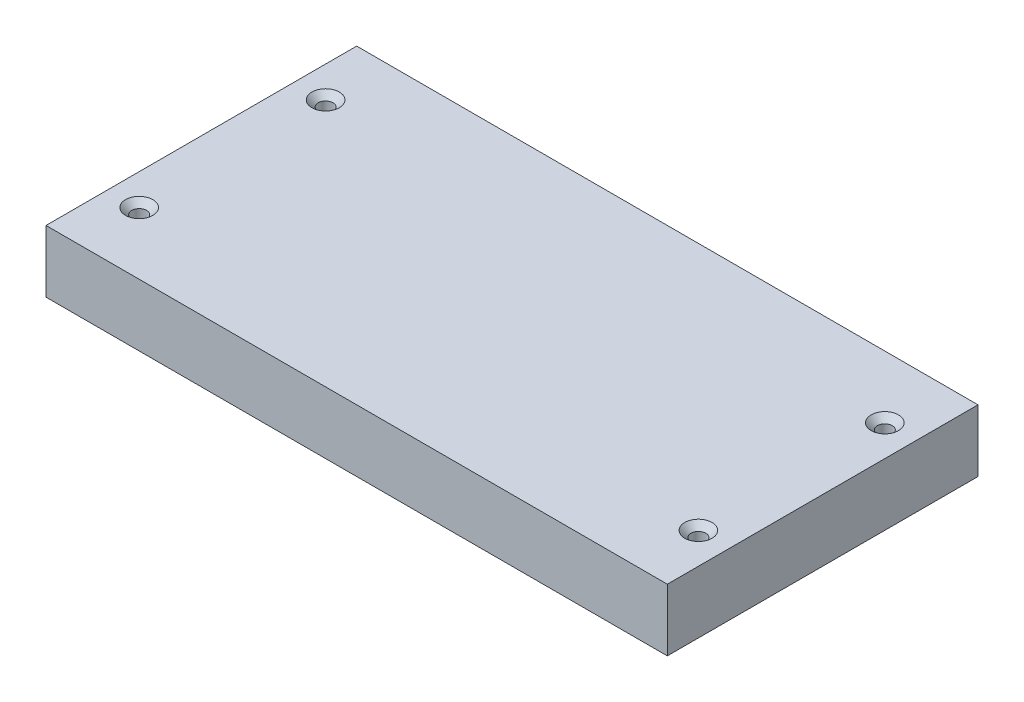
ISO-10303-21;
HEADER;
FILE_DESCRIPTION(('STEP AP214'),'2;1');
FILE_NAME('part.step','',(''),(''),'','','');
FILE_SCHEMA(('AUTOMOTIVE_DESIGN { 1 0 10303 214 1 1 1 1 }'));
ENDSEC;
DATA;
#1=APPLICATION_CONTEXT('core data for automotive mechanical design processes');
#2=APPLICATION_PROTOCOL_DEFINITION('international standard','automotive_design',2000,#1);
#3=PRODUCT_CONTEXT('',#1,'mechanical');
#4=PRODUCT('Part','Part','',(#3));
#5=PRODUCT_RELATED_PRODUCT_CATEGORY('part','',(#4));
#6=PRODUCT_DEFINITION_FORMATION('','',#4);
#7=PRODUCT_DEFINITION_CONTEXT('part definition',#1,'design');
#8=PRODUCT_DEFINITION('design','',#6,#7);
#9=PRODUCT_DEFINITION_SHAPE('','',#8);
#10=(LENGTH_UNIT() NAMED_UNIT(*) SI_UNIT(.MILLI.,.METRE.));
#11=(NAMED_UNIT(*) PLANE_ANGLE_UNIT() SI_UNIT($,.RADIAN.));
#12=(NAMED_UNIT(*) SI_UNIT($,.STERADIAN.) SOLID_ANGLE_UNIT());
#13=UNCERTAINTY_MEASURE_WITH_UNIT(LENGTH_MEASURE(1.E-05),#10,'distance_accuracy_value','');
#14=(GEOMETRIC_REPRESENTATION_CONTEXT(3) GLOBAL_UNCERTAINTY_ASSIGNED_CONTEXT((#13)) GLOBAL_UNIT_ASSIGNED_CONTEXT((#10,
#11,#12)) REPRESENTATION_CONTEXT('',''));
#15=CARTESIAN_POINT('',(0.,0.,0.));
#16=DIRECTION('',(0.,0.,1.));
#17=DIRECTION('',(1.,0.,0.));
#18=AXIS2_PLACEMENT_3D('',#15,#16,#17);
#19=CARTESIAN_POINT('',(-50.,10.,-25.));
#20=DIRECTION('',(1.,0.,0.));
#21=DIRECTION('',(0.,0.,-1.));
#22=AXIS2_PLACEMENT_3D('',#19,#20,#21);
#23=PLANE('',#22);
#24=DIRECTION('',(0.,0.,1.));
#25=VECTOR('',#24,1.);
#26=CARTESIAN_POINT('',(-50.,0.,-25.));
#27=LINE('',#26,#25);
#28=CARTESIAN_POINT('',(-50.,0.,-25.));
#29=VERTEX_POINT('',#28);
#30=CARTESIAN_POINT('',(-50.,0.,25.));
#31=VERTEX_POINT('',#30);
#32=EDGE_CURVE('E96',#29,#31,#27,.T.);
#33=ORIENTED_EDGE('',*,*,#32,.T.);
#34=DIRECTION('',(0.,-1.,0.));
#35=VECTOR('',#34,1.);
#36=CARTESIAN_POINT('',(-50.,10.,25.));
#37=LINE('',#36,#35);
#38=CARTESIAN_POINT('',(-50.,10.,25.));
#39=VERTEX_POINT('',#38);
#40=EDGE_CURVE('E11',#39,#31,#37,.T.);
#41=ORIENTED_EDGE('',*,*,#40,.F.);
#42=DIRECTION('',(0.,0.,1.));
#43=VECTOR('',#42,1.);
#44=CARTESIAN_POINT('',(-50.,10.,-25.));
#45=LINE('',#44,#43);
#46=CARTESIAN_POINT('',(-50.,10.,-25.));
#47=VERTEX_POINT('',#46);
#48=EDGE_CURVE('E84',#47,#39,#45,.T.);
#49=ORIENTED_EDGE('',*,*,#48,.F.);
#50=DIRECTION('',(0.,-1.,0.));
#51=VECTOR('',#50,1.);
#52=CARTESIAN_POINT('',(-50.,10.,-25.));
#53=LINE('',#52,#51);
#54=EDGE_CURVE('E92',#47,#29,#53,.T.);
#55=ORIENTED_EDGE('',*,*,#54,.T.);
#56=EDGE_LOOP('',(#33,#41,#49,#55));
#57=FACE_BOUND('',#56,.T.);
#58=ADVANCED_FACE('F33',(#57),#23,.F.);
#59=CARTESIAN_POINT('',(-50.,10.,25.));
#60=DIRECTION('',(0.,0.,-1.));
#61=DIRECTION('',(-1.,0.,0.));
#62=AXIS2_PLACEMENT_3D('',#59,#60,#61);
#63=PLANE('',#62);
#64=DIRECTION('',(1.,0.,0.));
#65=VECTOR('',#64,1.);
#66=CARTESIAN_POINT('',(-50.,0.,25.));
#67=LINE('',#66,#65);
#68=CARTESIAN_POINT('',(50.,0.,25.));
#69=VERTEX_POINT('',#68);
#70=EDGE_CURVE('E88',#31,#69,#67,.T.);
#71=ORIENTED_EDGE('',*,*,#70,.T.);
#72=DIRECTION('',(0.,-1.,0.));
#73=VECTOR('',#72,1.);
#74=CARTESIAN_POINT('',(50.,10.,25.));
#75=LINE('',#74,#73);
#76=CARTESIAN_POINT('',(50.,10.,25.));
#77=VERTEX_POINT('',#76);
#78=EDGE_CURVE('E41',#77,#69,#75,.T.);
#79=ORIENTED_EDGE('',*,*,#78,.F.);
#80=DIRECTION('',(1.,0.,0.));
#81=VECTOR('',#80,1.);
#82=CARTESIAN_POINT('',(-50.,10.,25.));
#83=LINE('',#82,#81);
#84=EDGE_CURVE('E79',#39,#77,#83,.T.);
#85=ORIENTED_EDGE('',*,*,#84,.F.);
#86=ORIENTED_EDGE('',*,*,#40,.T.);
#87=EDGE_LOOP('',(#71,#79,#85,#86));
#88=FACE_BOUND('',#87,.T.);
#89=ADVANCED_FACE('F87',(#88),#63,.F.);
#90=CARTESIAN_POINT('',(50.,10.,-25.));
#91=DIRECTION('',(-1.,0.,0.));
#92=DIRECTION('',(0.,0.,1.));
#93=AXIS2_PLACEMENT_3D('',#90,#91,#92);
#94=PLANE('',#93);
#95=DIRECTION('',(0.,0.,-1.));
#96=VECTOR('',#95,1.);
#97=CARTESIAN_POINT('',(50.,0.,-25.));
#98=LINE('',#97,#96);
#99=CARTESIAN_POINT('',(50.,0.,-25.));
#100=VERTEX_POINT('',#99);
#101=EDGE_CURVE('E66',#69,#100,#98,.T.);
#102=ORIENTED_EDGE('',*,*,#101,.T.);
#103=DIRECTION('',(0.,-1.,0.));
#104=VECTOR('',#103,1.);
#105=CARTESIAN_POINT('',(50.,10.,-25.));
#106=LINE('',#105,#104);
#107=CARTESIAN_POINT('',(50.,10.,-25.));
#108=VERTEX_POINT('',#107);
#109=EDGE_CURVE('E89',#108,#100,#106,.T.);
#110=ORIENTED_EDGE('',*,*,#109,.F.);
#111=DIRECTION('',(0.,0.,-1.));
#112=VECTOR('',#111,1.);
#113=CARTESIAN_POINT('',(50.,10.,-25.));
#114=LINE('',#113,#112);
#115=EDGE_CURVE('E82',#77,#108,#114,.T.);
#116=ORIENTED_EDGE('',*,*,#115,.F.);
#117=ORIENTED_EDGE('',*,*,#78,.T.);
#118=EDGE_LOOP('',(#102,#110,#116,#117));
#119=FACE_BOUND('',#118,.T.);
#120=ADVANCED_FACE('F90',(#119),#94,.F.);
#121=CARTESIAN_POINT('',(-50.,10.,-25.));
#122=DIRECTION('',(0.,0.,1.));
#123=DIRECTION('',(1.,0.,0.));
#124=AXIS2_PLACEMENT_3D('',#121,#122,#123);
#125=PLANE('',#124);
#126=DIRECTION('',(-1.,0.,0.));
#127=VECTOR('',#126,1.);
#128=CARTESIAN_POINT('',(-50.,0.,-25.));
#129=LINE('',#128,#127);
#130=EDGE_CURVE('E72',#100,#29,#129,.T.);
#131=ORIENTED_EDGE('',*,*,#130,.T.);
#132=ORIENTED_EDGE('',*,*,#54,.F.);
#133=DIRECTION('',(-1.,0.,0.));
#134=VECTOR('',#133,1.);
#135=CARTESIAN_POINT('',(-50.,10.,-25.));
#136=LINE('',#135,#134);
#137=EDGE_CURVE('E49',#108,#47,#136,.T.);
#138=ORIENTED_EDGE('',*,*,#137,.F.);
#139=ORIENTED_EDGE('',*,*,#109,.T.);
#140=EDGE_LOOP('',(#131,#132,#138,#139));
#141=FACE_BOUND('',#140,.T.);
#142=ADVANCED_FACE('F104',(#141),#125,.F.);
#143=CARTESIAN_POINT('',(0.,10.,0.));
#144=DIRECTION('',(0.,1.,0.));
#145=DIRECTION('',(0.,0.,1.));
#146=AXIS2_PLACEMENT_3D('',#143,#144,#145);
#147=PLANE('',#146);
#148=CARTESIAN_POINT('',(-45.,10.,-15.));
#149=DIRECTION('',(0.,1.,0.));
#150=DIRECTION('',(0.,0.,1.));
#151=AXIS2_PLACEMENT_3D('',#148,#149,#150);
#152=CIRCLE('',#151,2.2);
#153=CARTESIAN_POINT('',(-45.,10.,-12.8));
#154=VERTEX_POINT('',#153);
#155=EDGE_CURVE('E142',#154,#154,#152,.T.);
#156=ORIENTED_EDGE('',*,*,#155,.F.);
#157=EDGE_LOOP('',(#156));
#158=FACE_BOUND('',#157,.T.);
#159=CARTESIAN_POINT('',(45.,10.,-15.));
#160=DIRECTION('',(0.,1.,0.));
#161=DIRECTION('',(0.,0.,1.));
#162=AXIS2_PLACEMENT_3D('',#159,#160,#161);
#163=CIRCLE('',#162,2.2);
#164=CARTESIAN_POINT('',(45.,10.,-12.8));
#165=VERTEX_POINT('',#164);
#166=EDGE_CURVE('E133',#165,#165,#163,.T.);
#167=ORIENTED_EDGE('',*,*,#166,.F.);
#168=EDGE_LOOP('',(#167));
#169=FACE_BOUND('',#168,.T.);
#170=CARTESIAN_POINT('',(45.,10.,15.));
#171=DIRECTION('',(0.,1.,0.));
#172=DIRECTION('',(0.,0.,1.));
#173=AXIS2_PLACEMENT_3D('',#170,#171,#172);
#174=CIRCLE('',#173,2.2);
#175=CARTESIAN_POINT('',(45.,10.,17.2));
#176=VERTEX_POINT('',#175);
#177=EDGE_CURVE('E124',#176,#176,#174,.T.);
#178=ORIENTED_EDGE('',*,*,#177,.F.);
#179=EDGE_LOOP('',(#178));
#180=FACE_BOUND('',#179,.T.);
#181=CARTESIAN_POINT('',(-45.,10.,15.));
#182=DIRECTION('',(0.,1.,0.));
#183=DIRECTION('',(0.,0.,1.));
#184=AXIS2_PLACEMENT_3D('',#181,#182,#183);
#185=CIRCLE('',#184,2.2);
#186=CARTESIAN_POINT('',(-45.,10.,17.2));
#187=VERTEX_POINT('',#186);
#188=EDGE_CURVE('E115',#187,#187,#185,.T.);
#189=ORIENTED_EDGE('',*,*,#188,.F.);
#190=EDGE_LOOP('',(#189));
#191=FACE_BOUND('',#190,.T.);
#192=ORIENTED_EDGE('',*,*,#48,.T.);
#193=ORIENTED_EDGE('',*,*,#84,.T.);
#194=ORIENTED_EDGE('',*,*,#115,.T.);
#195=ORIENTED_EDGE('',*,*,#137,.T.);
#196=EDGE_LOOP('',(#192,#193,#194,#195));
#197=FACE_BOUND('',#196,.T.);
#198=ADVANCED_FACE('F80',(#158,#169,#180,#191,#197),#147,.T.);
#199=CARTESIAN_POINT('',(0.,0.,0.));
#200=DIRECTION('',(0.,1.,0.));
#201=DIRECTION('',(0.,0.,1.));
#202=AXIS2_PLACEMENT_3D('',#199,#200,#201);
#203=PLANE('',#202);
#204=CARTESIAN_POINT('',(-45.,0.,-15.));
#205=DIRECTION('',(0.,1.,0.));
#206=DIRECTION('',(0.,0.,1.));
#207=AXIS2_PLACEMENT_3D('',#204,#205,#206);
#208=CIRCLE('',#207,1.2);
#209=CARTESIAN_POINT('',(-45.,0.,-13.8));
#210=VERTEX_POINT('',#209);
#211=EDGE_CURVE('E136',#210,#210,#208,.T.);
#212=ORIENTED_EDGE('',*,*,#211,.T.);
#213=EDGE_LOOP('',(#212));
#214=FACE_BOUND('',#213,.T.);
#215=CARTESIAN_POINT('',(45.,0.,-15.));
#216=DIRECTION('',(0.,1.,0.));
#217=DIRECTION('',(0.,0.,1.));
#218=AXIS2_PLACEMENT_3D('',#215,#216,#217);
#219=CIRCLE('',#218,1.2);
#220=CARTESIAN_POINT('',(45.,0.,-13.8));
#221=VERTEX_POINT('',#220);
#222=EDGE_CURVE('E127',#221,#221,#219,.T.);
#223=ORIENTED_EDGE('',*,*,#222,.T.);
#224=EDGE_LOOP('',(#223));
#225=FACE_BOUND('',#224,.T.);
#226=CARTESIAN_POINT('',(45.,0.,15.));
#227=DIRECTION('',(0.,1.,0.));
#228=DIRECTION('',(0.,0.,1.));
#229=AXIS2_PLACEMENT_3D('',#226,#227,#228);
#230=CIRCLE('',#229,1.2);
#231=CARTESIAN_POINT('',(45.,0.,16.2));
#232=VERTEX_POINT('',#231);
#233=EDGE_CURVE('E118',#232,#232,#230,.T.);
#234=ORIENTED_EDGE('',*,*,#233,.T.);
#235=EDGE_LOOP('',(#234));
#236=FACE_BOUND('',#235,.T.);
#237=CARTESIAN_POINT('',(-45.,0.,15.));
#238=DIRECTION('',(0.,1.,0.));
#239=DIRECTION('',(0.,0.,1.));
#240=AXIS2_PLACEMENT_3D('',#237,#238,#239);
#241=CIRCLE('',#240,1.2);
#242=CARTESIAN_POINT('',(-45.,0.,16.2));
#243=VERTEX_POINT('',#242);
#244=EDGE_CURVE('E99',#243,#243,#241,.T.);
#245=ORIENTED_EDGE('',*,*,#244,.T.);
#246=EDGE_LOOP('',(#245));
#247=FACE_BOUND('',#246,.T.);
#248=ORIENTED_EDGE('',*,*,#32,.F.);
#249=ORIENTED_EDGE('',*,*,#130,.F.);
#250=ORIENTED_EDGE('',*,*,#101,.F.);
#251=ORIENTED_EDGE('',*,*,#70,.F.);
#252=EDGE_LOOP('',(#248,#249,#250,#251));
#253=FACE_BOUND('',#252,.T.);
#254=ADVANCED_FACE('F107',(#214,#225,#236,#247,#253),#203,.F.);
#255=CARTESIAN_POINT('',(-45.,10.,15.));
#256=DIRECTION('',(0.,1.,0.));
#257=DIRECTION('',(0.,0.,1.));
#258=AXIS2_PLACEMENT_3D('',#255,#256,#257);
#259=CYLINDRICAL_SURFACE('',#258,1.2);
#260=ORIENTED_EDGE('',*,*,#244,.F.);
#261=EDGE_LOOP('',(#260));
#262=FACE_BOUND('',#261,.T.);
#263=CARTESIAN_POINT('',(-45.,9.,15.));
#264=DIRECTION('',(0.,1.,0.));
#265=DIRECTION('',(0.,0.,1.));
#266=AXIS2_PLACEMENT_3D('',#263,#264,#265);
#267=CIRCLE('',#266,1.2);
#268=CARTESIAN_POINT('',(-45.,9.,16.2));
#269=VERTEX_POINT('',#268);
#270=EDGE_CURVE('E112',#269,#269,#267,.T.);
#271=ORIENTED_EDGE('',*,*,#270,.T.);
#272=EDGE_LOOP('',(#271));
#273=FACE_BOUND('',#272,.T.);
#274=ADVANCED_FACE('F160',(#262,#273),#259,.F.);
#275=CARTESIAN_POINT('',(-45.,10.,15.));
#276=DIRECTION('',(0.,1.,0.));
#277=DIRECTION('',(0.,0.,1.));
#278=AXIS2_PLACEMENT_3D('',#275,#276,#277);
#279=CONICAL_SURFACE('',#278,2.2,0.785398163397447);
#280=ORIENTED_EDGE('',*,*,#270,.F.);
#281=EDGE_LOOP('',(#280));
#282=FACE_BOUND('',#281,.T.);
#283=ORIENTED_EDGE('',*,*,#188,.T.);
#284=EDGE_LOOP('',(#283));
#285=FACE_BOUND('',#284,.T.);
#286=ADVANCED_FACE('F157',(#282,#285),#279,.F.);
#287=CARTESIAN_POINT('',(45.,10.,15.));
#288=DIRECTION('',(0.,1.,0.));
#289=DIRECTION('',(0.,0.,1.));
#290=AXIS2_PLACEMENT_3D('',#287,#288,#289);
#291=CYLINDRICAL_SURFACE('',#290,1.2);
#292=ORIENTED_EDGE('',*,*,#233,.F.);
#293=EDGE_LOOP('',(#292));
#294=FACE_BOUND('',#293,.T.);
#295=CARTESIAN_POINT('',(45.,9.,15.));
#296=DIRECTION('',(0.,1.,0.));
#297=DIRECTION('',(0.,0.,1.));
#298=AXIS2_PLACEMENT_3D('',#295,#296,#297);
#299=CIRCLE('',#298,1.2);
#300=CARTESIAN_POINT('',(45.,9.,16.2));
#301=VERTEX_POINT('',#300);
#302=EDGE_CURVE('E121',#301,#301,#299,.T.);
#303=ORIENTED_EDGE('',*,*,#302,.T.);
#304=EDGE_LOOP('',(#303));
#305=FACE_BOUND('',#304,.T.);
#306=ADVANCED_FACE('F159',(#294,#305),#291,.F.);
#307=CARTESIAN_POINT('',(45.,10.,15.));
#308=DIRECTION('',(0.,1.,0.));
#309=DIRECTION('',(0.,0.,1.));
#310=AXIS2_PLACEMENT_3D('',#307,#308,#309);
#311=CONICAL_SURFACE('',#310,2.2,0.785398163397447);
#312=ORIENTED_EDGE('',*,*,#302,.F.);
#313=EDGE_LOOP('',(#312));
#314=FACE_BOUND('',#313,.T.);
#315=ORIENTED_EDGE('',*,*,#177,.T.);
#316=EDGE_LOOP('',(#315));
#317=FACE_BOUND('',#316,.T.);
#318=ADVANCED_FACE('F167',(#314,#317),#311,.F.);
#319=CARTESIAN_POINT('',(45.,10.,-15.));
#320=DIRECTION('',(0.,1.,0.));
#321=DIRECTION('',(0.,0.,1.));
#322=AXIS2_PLACEMENT_3D('',#319,#320,#321);
#323=CYLINDRICAL_SURFACE('',#322,1.2);
#324=ORIENTED_EDGE('',*,*,#222,.F.);
#325=EDGE_LOOP('',(#324));
#326=FACE_BOUND('',#325,.T.);
#327=CARTESIAN_POINT('',(45.,9.,-15.));
#328=DIRECTION('',(0.,1.,0.));
#329=DIRECTION('',(0.,0.,1.));
#330=AXIS2_PLACEMENT_3D('',#327,#328,#329);
#331=CIRCLE('',#330,1.2);
#332=CARTESIAN_POINT('',(45.,9.,-13.8));
#333=VERTEX_POINT('',#332);
#334=EDGE_CURVE('E130',#333,#333,#331,.T.);
#335=ORIENTED_EDGE('',*,*,#334,.T.);
#336=EDGE_LOOP('',(#335));
#337=FACE_BOUND('',#336,.T.);
#338=ADVANCED_FACE('F201',(#326,#337),#323,.F.);
#339=CARTESIAN_POINT('',(45.,10.,-15.));
#340=DIRECTION('',(0.,1.,0.));
#341=DIRECTION('',(0.,0.,1.));
#342=AXIS2_PLACEMENT_3D('',#339,#340,#341);
#343=CONICAL_SURFACE('',#342,2.2,0.785398163397447);
#344=ORIENTED_EDGE('',*,*,#334,.F.);
#345=EDGE_LOOP('',(#344));
#346=FACE_BOUND('',#345,.T.);
#347=ORIENTED_EDGE('',*,*,#166,.T.);
#348=EDGE_LOOP('',(#347));
#349=FACE_BOUND('',#348,.T.);
#350=ADVANCED_FACE('F206',(#346,#349),#343,.F.);
#351=CARTESIAN_POINT('',(-45.,10.,-15.));
#352=DIRECTION('',(0.,1.,0.));
#353=DIRECTION('',(0.,0.,1.));
#354=AXIS2_PLACEMENT_3D('',#351,#352,#353);
#355=CYLINDRICAL_SURFACE('',#354,1.2);
#356=ORIENTED_EDGE('',*,*,#211,.F.);
#357=EDGE_LOOP('',(#356));
#358=FACE_BOUND('',#357,.T.);
#359=CARTESIAN_POINT('',(-45.,9.,-15.));
#360=DIRECTION('',(0.,1.,0.));
#361=DIRECTION('',(0.,0.,1.));
#362=AXIS2_PLACEMENT_3D('',#359,#360,#361);
#363=CIRCLE('',#362,1.2);
#364=CARTESIAN_POINT('',(-45.,9.,-13.8));
#365=VERTEX_POINT('',#364);
#366=EDGE_CURVE('E139',#365,#365,#363,.T.);
#367=ORIENTED_EDGE('',*,*,#366,.T.);
#368=EDGE_LOOP('',(#367));
#369=FACE_BOUND('',#368,.T.);
#370=ADVANCED_FACE('F212',(#358,#369),#355,.F.);
#371=CARTESIAN_POINT('',(-45.,10.,-15.));
#372=DIRECTION('',(0.,1.,0.));
#373=DIRECTION('',(0.,0.,1.));
#374=AXIS2_PLACEMENT_3D('',#371,#372,#373);
#375=CONICAL_SURFACE('',#374,2.2,0.785398163397447);
#376=ORIENTED_EDGE('',*,*,#366,.F.);
#377=EDGE_LOOP('',(#376));
#378=FACE_BOUND('',#377,.T.);
#379=ORIENTED_EDGE('',*,*,#155,.T.);
#380=EDGE_LOOP('',(#379));
#381=FACE_BOUND('',#380,.T.);
#382=ADVANCED_FACE('F146',(#378,#381),#375,.F.);
#383=CLOSED_SHELL('',(#58,#89,#120,#142,#198,#254,#274,#286,#306,#318,#338,#350,#370,#382));
#384=MANIFOLD_SOLID_BREP('B2',#383);
#385=ADVANCED_BREP_SHAPE_REPRESENTATION('',(#18,#384),#14);
#386=SHAPE_DEFINITION_REPRESENTATION(#9,#385);
ENDSEC;
END-ISO-10303-21;
